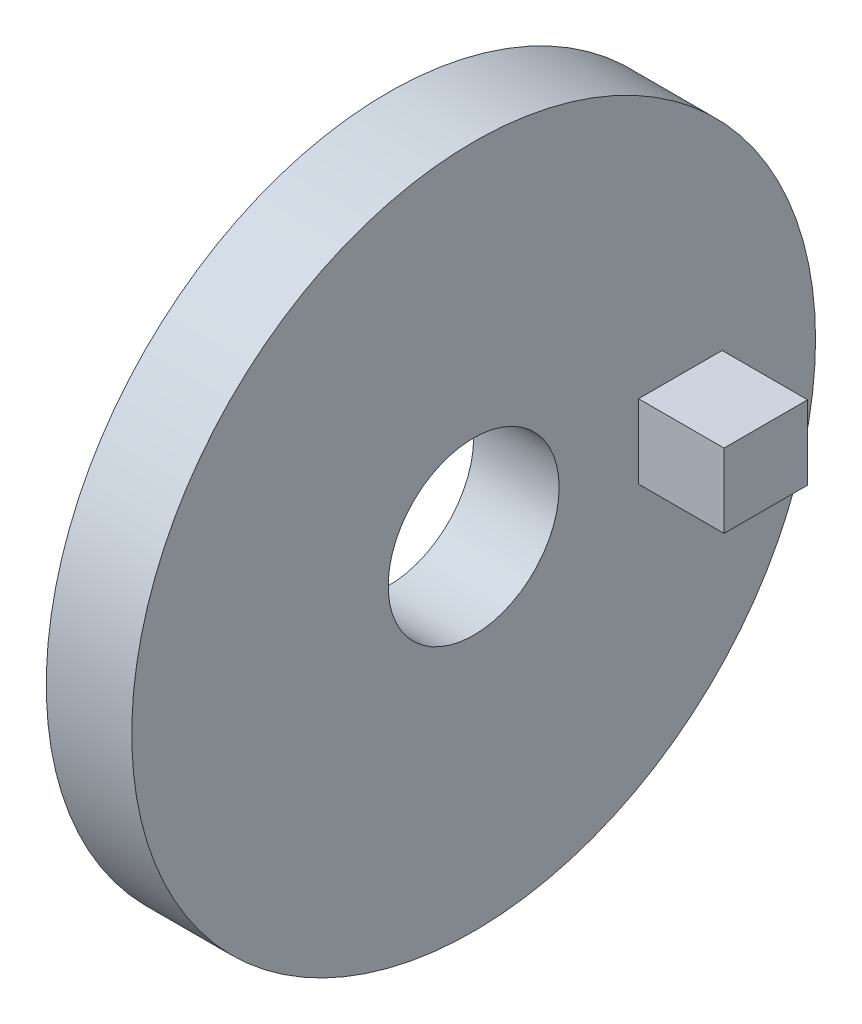
ISO-10303-21;
HEADER;
FILE_DESCRIPTION(('STEP AP214'),'2;1');
FILE_NAME('part.step','',(''),(''),'','','');
FILE_SCHEMA(('AUTOMOTIVE_DESIGN { 1 0 10303 214 1 1 1 1 }'));
ENDSEC;
DATA;
#1=APPLICATION_CONTEXT('core data for automotive mechanical design processes');
#2=APPLICATION_PROTOCOL_DEFINITION('international standard','automotive_design',2000,#1);
#3=PRODUCT_CONTEXT('',#1,'mechanical');
#4=PRODUCT('Part','Part','',(#3));
#5=PRODUCT_RELATED_PRODUCT_CATEGORY('part','',(#4));
#6=PRODUCT_DEFINITION_FORMATION('','',#4);
#7=PRODUCT_DEFINITION_CONTEXT('part definition',#1,'design');
#8=PRODUCT_DEFINITION('design','',#6,#7);
#9=PRODUCT_DEFINITION_SHAPE('','',#8);
#10=(LENGTH_UNIT() NAMED_UNIT(*) SI_UNIT(.MILLI.,.METRE.));
#11=(NAMED_UNIT(*) PLANE_ANGLE_UNIT() SI_UNIT($,.RADIAN.));
#12=(NAMED_UNIT(*) SI_UNIT($,.STERADIAN.) SOLID_ANGLE_UNIT());
#13=UNCERTAINTY_MEASURE_WITH_UNIT(LENGTH_MEASURE(1.E-05),#10,'distance_accuracy_value','');
#14=(GEOMETRIC_REPRESENTATION_CONTEXT(3) GLOBAL_UNCERTAINTY_ASSIGNED_CONTEXT((#13)) GLOBAL_UNIT_ASSIGNED_CONTEXT((#10,
#11,#12)) REPRESENTATION_CONTEXT('',''));
#15=CARTESIAN_POINT('',(0.,0.,0.));
#16=DIRECTION('',(0.,0.,1.));
#17=DIRECTION('',(1.,0.,0.));
#18=AXIS2_PLACEMENT_3D('',#15,#16,#17);
#19=CARTESIAN_POINT('',(10.,0.,0.));
#20=DIRECTION('',(1.,0.,0.));
#21=DIRECTION('',(0.,0.,-1.));
#22=AXIS2_PLACEMENT_3D('',#19,#20,#21);
#23=PLANE('',#22);
#24=CARTESIAN_POINT('',(10.,0.,0.));
#25=DIRECTION('',(1.,0.,0.));
#26=DIRECTION('',(0.,0.,-1.));
#27=AXIS2_PLACEMENT_3D('',#24,#25,#26);
#28=CIRCLE('',#27,40.);
#29=CARTESIAN_POINT('',(10.,0.,-40.));
#30=VERTEX_POINT('',#29);
#31=EDGE_CURVE('E11',#30,#30,#28,.T.);
#32=ORIENTED_EDGE('',*,*,#31,.T.);
#33=EDGE_LOOP('',(#32));
#34=FACE_BOUND('',#33,.T.);
#35=CARTESIAN_POINT('',(10.,0.,0.));
#36=DIRECTION('',(1.,0.,0.));
#37=DIRECTION('',(0.,0.,-1.));
#38=AXIS2_PLACEMENT_3D('',#35,#36,#37);
#39=CIRCLE('',#38,10.);
#40=CARTESIAN_POINT('',(10.,0.,-10.));
#41=VERTEX_POINT('',#40);
#42=EDGE_CURVE('E133',#41,#41,#39,.T.);
#43=ORIENTED_EDGE('',*,*,#42,.F.);
#44=EDGE_LOOP('',(#43));
#45=FACE_BOUND('',#44,.T.);
#46=DIRECTION('',(0.,0.,1.));
#47=VECTOR('',#46,1.);
#48=CARTESIAN_POINT('',(10.,4.32481347318616,-19.2924287977784));
#49=LINE('',#48,#47);
#50=CARTESIAN_POINT('',(10.,4.32481347318616,-29.0702679545472));
#51=VERTEX_POINT('',#50);
#52=CARTESIAN_POINT('',(10.,4.32481347318616,-19.2924287977784));
#53=VERTEX_POINT('',#52);
#54=EDGE_CURVE('E101',#51,#53,#49,.T.);
#55=ORIENTED_EDGE('',*,*,#54,.F.);
#56=DIRECTION('',(0.,1.,0.));
#57=VECTOR('',#56,1.);
#58=CARTESIAN_POINT('',(10.,4.32481347318616,-29.0702679545472));
#59=LINE('',#58,#57);
#60=CARTESIAN_POINT('',(10.,-4.32481347318616,-29.0702679545472));
#61=VERTEX_POINT('',#60);
#62=EDGE_CURVE('E115',#61,#51,#59,.T.);
#63=ORIENTED_EDGE('',*,*,#62,.F.);
#64=DIRECTION('',(0.,0.,-1.));
#65=VECTOR('',#64,1.);
#66=CARTESIAN_POINT('',(10.,-4.32481347318616,-19.2924287977784));
#67=LINE('',#66,#65);
#68=CARTESIAN_POINT('',(10.,-4.32481347318616,-19.2924287977784));
#69=VERTEX_POINT('',#68);
#70=EDGE_CURVE('E81',#69,#61,#67,.T.);
#71=ORIENTED_EDGE('',*,*,#70,.F.);
#72=DIRECTION('',(0.,-1.,0.));
#73=VECTOR('',#72,1.);
#74=CARTESIAN_POINT('',(10.,4.32481347318616,-19.2924287977784));
#75=LINE('',#74,#73);
#76=EDGE_CURVE('E121',#53,#69,#75,.T.);
#77=ORIENTED_EDGE('',*,*,#76,.F.);
#78=EDGE_LOOP('',(#55,#63,#71,#77));
#79=FACE_BOUND('',#78,.T.);
#80=ADVANCED_FACE('F43',(#34,#45,#79),#23,.T.);
#81=CARTESIAN_POINT('',(0.,0.,0.));
#82=DIRECTION('',(1.,0.,0.));
#83=DIRECTION('',(0.,0.,-1.));
#84=AXIS2_PLACEMENT_3D('',#81,#82,#83);
#85=PLANE('',#84);
#86=CARTESIAN_POINT('',(0.,0.,0.));
#87=DIRECTION('',(1.,0.,0.));
#88=DIRECTION('',(0.,0.,-1.));
#89=AXIS2_PLACEMENT_3D('',#86,#87,#88);
#90=CIRCLE('',#89,40.);
#91=CARTESIAN_POINT('',(0.,0.,-40.));
#92=VERTEX_POINT('',#91);
#93=EDGE_CURVE('E47',#92,#92,#90,.T.);
#94=ORIENTED_EDGE('',*,*,#93,.F.);
#95=EDGE_LOOP('',(#94));
#96=FACE_BOUND('',#95,.T.);
#97=CARTESIAN_POINT('',(0.,0.,0.));
#98=DIRECTION('',(1.,0.,0.));
#99=DIRECTION('',(0.,0.,-1.));
#100=AXIS2_PLACEMENT_3D('',#97,#98,#99);
#101=CIRCLE('',#100,10.);
#102=CARTESIAN_POINT('',(0.,0.,-10.));
#103=VERTEX_POINT('',#102);
#104=EDGE_CURVE('E132',#103,#103,#101,.T.);
#105=ORIENTED_EDGE('',*,*,#104,.T.);
#106=EDGE_LOOP('',(#105));
#107=FACE_BOUND('',#106,.T.);
#108=ADVANCED_FACE('F141',(#96,#107),#85,.F.);
#109=CARTESIAN_POINT('',(10.,0.,0.));
#110=DIRECTION('',(-1.,0.,0.));
#111=DIRECTION('',(0.,0.,1.));
#112=AXIS2_PLACEMENT_3D('',#109,#110,#111);
#113=CYLINDRICAL_SURFACE('',#112,40.);
#114=ORIENTED_EDGE('',*,*,#31,.F.);
#115=EDGE_LOOP('',(#114));
#116=FACE_BOUND('',#115,.T.);
#117=ORIENTED_EDGE('',*,*,#93,.T.);
#118=EDGE_LOOP('',(#117));
#119=FACE_BOUND('',#118,.T.);
#120=ADVANCED_FACE('F45',(#116,#119),#113,.T.);
#121=CARTESIAN_POINT('',(10.,0.,0.));
#122=DIRECTION('',(-1.,0.,0.));
#123=DIRECTION('',(0.,0.,1.));
#124=AXIS2_PLACEMENT_3D('',#121,#122,#123);
#125=CYLINDRICAL_SURFACE('',#124,10.);
#126=ORIENTED_EDGE('',*,*,#42,.T.);
#127=EDGE_LOOP('',(#126));
#128=FACE_BOUND('',#127,.T.);
#129=ORIENTED_EDGE('',*,*,#104,.F.);
#130=EDGE_LOOP('',(#129));
#131=FACE_BOUND('',#130,.T.);
#132=ADVANCED_FACE('F143',(#128,#131),#125,.F.);
#133=CARTESIAN_POINT('',(20.,4.32481347318616,-29.0702679545472));
#134=DIRECTION('',(0.,0.,1.));
#135=DIRECTION('',(1.,0.,0.));
#136=AXIS2_PLACEMENT_3D('',#133,#134,#135);
#137=PLANE('',#136);
#138=ORIENTED_EDGE('',*,*,#62,.T.);
#139=DIRECTION('',(-1.,0.,0.));
#140=VECTOR('',#139,1.);
#141=CARTESIAN_POINT('',(20.,4.32481347318616,-29.0702679545472));
#142=LINE('',#141,#140);
#143=CARTESIAN_POINT('',(20.,4.32481347318616,-29.0702679545472));
#144=VERTEX_POINT('',#143);
#145=EDGE_CURVE('E105',#144,#51,#142,.T.);
#146=ORIENTED_EDGE('',*,*,#145,.F.);
#147=DIRECTION('',(0.,1.,0.));
#148=VECTOR('',#147,1.);
#149=CARTESIAN_POINT('',(20.,4.32481347318616,-29.0702679545472));
#150=LINE('',#149,#148);
#151=CARTESIAN_POINT('',(20.,-4.32481347318616,-29.0702679545472));
#152=VERTEX_POINT('',#151);
#153=EDGE_CURVE('E93',#152,#144,#150,.T.);
#154=ORIENTED_EDGE('',*,*,#153,.F.);
#155=DIRECTION('',(-1.,0.,0.));
#156=VECTOR('',#155,1.);
#157=CARTESIAN_POINT('',(20.,-4.32481347318616,-29.0702679545472));
#158=LINE('',#157,#156);
#159=EDGE_CURVE('E111',#152,#61,#158,.T.);
#160=ORIENTED_EDGE('',*,*,#159,.T.);
#161=EDGE_LOOP('',(#138,#146,#154,#160));
#162=FACE_BOUND('',#161,.T.);
#163=ADVANCED_FACE('F145',(#162),#137,.F.);
#164=CARTESIAN_POINT('',(20.,4.32481347318616,-19.2924287977784));
#165=DIRECTION('',(0.,-1.,0.));
#166=DIRECTION('',(0.,0.,-1.));
#167=AXIS2_PLACEMENT_3D('',#164,#165,#166);
#168=PLANE('',#167);
#169=ORIENTED_EDGE('',*,*,#54,.T.);
#170=DIRECTION('',(-1.,0.,0.));
#171=VECTOR('',#170,1.);
#172=CARTESIAN_POINT('',(20.,4.32481347318616,-19.2924287977784));
#173=LINE('',#172,#171);
#174=CARTESIAN_POINT('',(20.,4.32481347318616,-19.2924287977784));
#175=VERTEX_POINT('',#174);
#176=EDGE_CURVE('E98',#175,#53,#173,.T.);
#177=ORIENTED_EDGE('',*,*,#176,.F.);
#178=DIRECTION('',(0.,0.,1.));
#179=VECTOR('',#178,1.);
#180=CARTESIAN_POINT('',(20.,4.32481347318616,-19.2924287977784));
#181=LINE('',#180,#179);
#182=EDGE_CURVE('E88',#144,#175,#181,.T.);
#183=ORIENTED_EDGE('',*,*,#182,.F.);
#184=ORIENTED_EDGE('',*,*,#145,.T.);
#185=EDGE_LOOP('',(#169,#177,#183,#184));
#186=FACE_BOUND('',#185,.T.);
#187=ADVANCED_FACE('F99',(#186),#168,.F.);
#188=CARTESIAN_POINT('',(20.,4.32481347318616,-19.2924287977784));
#189=DIRECTION('',(0.,0.,-1.));
#190=DIRECTION('',(-1.,0.,0.));
#191=AXIS2_PLACEMENT_3D('',#188,#189,#190);
#192=PLANE('',#191);
#193=ORIENTED_EDGE('',*,*,#76,.T.);
#194=DIRECTION('',(-1.,0.,0.));
#195=VECTOR('',#194,1.);
#196=CARTESIAN_POINT('',(20.,-4.32481347318616,-19.2924287977784));
#197=LINE('',#196,#195);
#198=CARTESIAN_POINT('',(20.,-4.32481347318616,-19.2924287977784));
#199=VERTEX_POINT('',#198);
#200=EDGE_CURVE('E59',#199,#69,#197,.T.);
#201=ORIENTED_EDGE('',*,*,#200,.F.);
#202=DIRECTION('',(0.,-1.,0.));
#203=VECTOR('',#202,1.);
#204=CARTESIAN_POINT('',(20.,4.32481347318616,-19.2924287977784));
#205=LINE('',#204,#203);
#206=EDGE_CURVE('E91',#175,#199,#205,.T.);
#207=ORIENTED_EDGE('',*,*,#206,.F.);
#208=ORIENTED_EDGE('',*,*,#176,.T.);
#209=EDGE_LOOP('',(#193,#201,#207,#208));
#210=FACE_BOUND('',#209,.T.);
#211=ADVANCED_FACE('F107',(#210),#192,.F.);
#212=CARTESIAN_POINT('',(20.,-4.32481347318616,-19.2924287977784));
#213=DIRECTION('',(0.,1.,0.));
#214=DIRECTION('',(0.,0.,1.));
#215=AXIS2_PLACEMENT_3D('',#212,#213,#214);
#216=PLANE('',#215);
#217=ORIENTED_EDGE('',*,*,#70,.T.);
#218=ORIENTED_EDGE('',*,*,#159,.F.);
#219=DIRECTION('',(0.,0.,-1.));
#220=VECTOR('',#219,1.);
#221=CARTESIAN_POINT('',(20.,-4.32481347318616,-19.2924287977784));
#222=LINE('',#221,#220);
#223=EDGE_CURVE('E67',#199,#152,#222,.T.);
#224=ORIENTED_EDGE('',*,*,#223,.F.);
#225=ORIENTED_EDGE('',*,*,#200,.T.);
#226=EDGE_LOOP('',(#217,#218,#224,#225));
#227=FACE_BOUND('',#226,.T.);
#228=ADVANCED_FACE('F169',(#227),#216,.F.);
#229=CARTESIAN_POINT('',(20.,0.,0.));
#230=DIRECTION('',(1.,0.,0.));
#231=DIRECTION('',(0.,0.,-1.));
#232=AXIS2_PLACEMENT_3D('',#229,#230,#231);
#233=PLANE('',#232);
#234=ORIENTED_EDGE('',*,*,#153,.T.);
#235=ORIENTED_EDGE('',*,*,#182,.T.);
#236=ORIENTED_EDGE('',*,*,#206,.T.);
#237=ORIENTED_EDGE('',*,*,#223,.T.);
#238=EDGE_LOOP('',(#234,#235,#236,#237));
#239=FACE_BOUND('',#238,.T.);
#240=ADVANCED_FACE('F89',(#239),#233,.T.);
#241=CLOSED_SHELL('',(#80,#108,#120,#132,#163,#187,#211,#228,#240));
#242=MANIFOLD_SOLID_BREP('B2',#241);
#243=ADVANCED_BREP_SHAPE_REPRESENTATION('',(#18,#242),#14);
#244=SHAPE_DEFINITION_REPRESENTATION(#9,#243);
ENDSEC;
END-ISO-10303-21;
